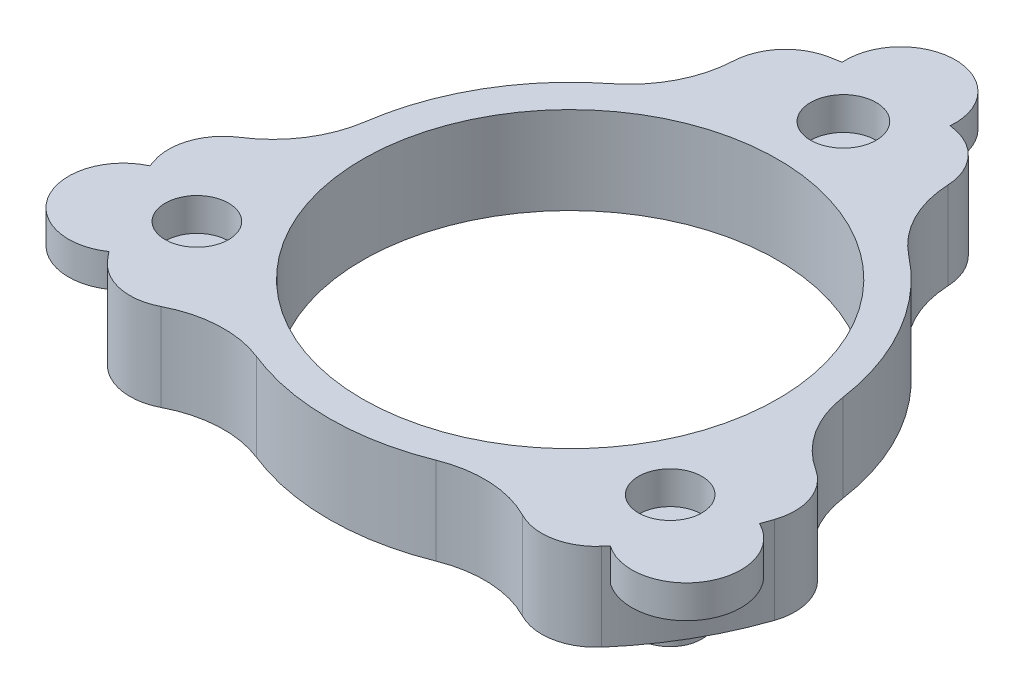
ISO-10303-21;
HEADER;
FILE_DESCRIPTION(('STEP AP214'),'2;1');
FILE_NAME('part.step','',(''),(''),'','','');
FILE_SCHEMA(('AUTOMOTIVE_DESIGN { 1 0 10303 214 1 1 1 1 }'));
ENDSEC;
DATA;
#1=APPLICATION_CONTEXT('core data for automotive mechanical design processes');
#2=APPLICATION_PROTOCOL_DEFINITION('international standard','automotive_design',2000,#1);
#3=PRODUCT_CONTEXT('',#1,'mechanical');
#4=PRODUCT('Part','Part','',(#3));
#5=PRODUCT_RELATED_PRODUCT_CATEGORY('part','',(#4));
#6=PRODUCT_DEFINITION_FORMATION('','',#4);
#7=PRODUCT_DEFINITION_CONTEXT('part definition',#1,'design');
#8=PRODUCT_DEFINITION('design','',#6,#7);
#9=PRODUCT_DEFINITION_SHAPE('','',#8);
#10=(LENGTH_UNIT() NAMED_UNIT(*) SI_UNIT(.MILLI.,.METRE.));
#11=(NAMED_UNIT(*) PLANE_ANGLE_UNIT() SI_UNIT($,.RADIAN.));
#12=(NAMED_UNIT(*) SI_UNIT($,.STERADIAN.) SOLID_ANGLE_UNIT());
#13=UNCERTAINTY_MEASURE_WITH_UNIT(LENGTH_MEASURE(1.E-05),#10,'distance_accuracy_value','');
#14=(GEOMETRIC_REPRESENTATION_CONTEXT(3) GLOBAL_UNCERTAINTY_ASSIGNED_CONTEXT((#13)) GLOBAL_UNIT_ASSIGNED_CONTEXT((#10,
#11,#12)) REPRESENTATION_CONTEXT('',''));
#15=CARTESIAN_POINT('',(0.,0.,0.));
#16=DIRECTION('',(0.,0.,1.));
#17=DIRECTION('',(1.,0.,0.));
#18=AXIS2_PLACEMENT_3D('',#15,#16,#17);
#19=CARTESIAN_POINT('',(0.,8.,0.));
#20=DIRECTION('',(0.,1.,0.));
#21=DIRECTION('',(0.,0.,1.));
#22=AXIS2_PLACEMENT_3D('',#19,#20,#21);
#23=PLANE('',#22);
#24=CARTESIAN_POINT('',(1.60090602130669E-12,8.,-24.9999999999991));
#25=DIRECTION('',(0.,1.,0.));
#26=DIRECTION('',(0.,0.,1.));
#27=AXIS2_PLACEMENT_3D('',#24,#25,#26);
#28=CIRCLE('',#27,3.);
#29=CARTESIAN_POINT('',(1.60090602130669E-12,8.,-21.9999999999991));
#30=VERTEX_POINT('',#29);
#31=EDGE_CURVE('E364',#30,#30,#28,.T.);
#32=ORIENTED_EDGE('',*,*,#31,.F.);
#33=EDGE_LOOP('',(#32));
#34=FACE_BOUND('',#33,.T.);
#35=CARTESIAN_POINT('',(21.650635094611,8.,12.5000000000018));
#36=DIRECTION('',(0.,1.,0.));
#37=DIRECTION('',(0.,0.,1.));
#38=AXIS2_PLACEMENT_3D('',#35,#36,#37);
#39=CIRCLE('',#38,2.9);
#40=CARTESIAN_POINT('',(21.650635094611,8.,15.4000000000018));
#41=VERTEX_POINT('',#40);
#42=EDGE_CURVE('E370',#41,#41,#39,.T.);
#43=ORIENTED_EDGE('',*,*,#42,.F.);
#44=EDGE_LOOP('',(#43));
#45=FACE_BOUND('',#44,.T.);
#46=CARTESIAN_POINT('',(-21.650635094611,8.,12.5));
#47=DIRECTION('',(0.,1.,0.));
#48=DIRECTION('',(0.,0.,1.));
#49=AXIS2_PLACEMENT_3D('',#46,#47,#48);
#50=CIRCLE('',#49,2.9);
#51=CARTESIAN_POINT('',(-21.650635094611,8.,15.4));
#52=VERTEX_POINT('',#51);
#53=EDGE_CURVE('E361',#52,#52,#50,.T.);
#54=ORIENTED_EDGE('',*,*,#53,.F.);
#55=EDGE_LOOP('',(#54));
#56=FACE_BOUND('',#55,.T.);
#57=CARTESIAN_POINT('',(0.,8.,0.));
#58=DIRECTION('',(0.,1.,0.));
#59=DIRECTION('',(0.,0.,1.));
#60=AXIS2_PLACEMENT_3D('',#57,#58,#59);
#61=CIRCLE('',#60,19.);
#62=CARTESIAN_POINT('',(0.,8.,19.));
#63=VERTEX_POINT('',#62);
#64=EDGE_CURVE('E401',#63,#63,#61,.T.);
#65=ORIENTED_EDGE('',*,*,#64,.F.);
#66=EDGE_LOOP('',(#65));
#67=FACE_BOUND('',#66,.T.);
#68=CARTESIAN_POINT('',(0.,8.,0.));
#69=DIRECTION('',(0.,1.,0.));
#70=DIRECTION('',(0.,0.,1.));
#71=AXIS2_PLACEMENT_3D('',#68,#69,#70);
#72=CIRCLE('',#71,30.);
#73=CARTESIAN_POINT('',(-4.73941231097717,8.,-29.6232673914705));
#74=VERTEX_POINT('',#73);
#75=CARTESIAN_POINT('',(-5.78788047023531,8.,-29.4363795270796));
#76=VERTEX_POINT('',#75);
#77=EDGE_CURVE('E405',#74,#76,#72,.T.);
#78=ORIENTED_EDGE('',*,*,#77,.T.);
#79=CARTESIAN_POINT('',(-4.82323372519609,8.,-24.5303162725663));
#80=DIRECTION('',(0.,1.,0.));
#81=DIRECTION('',(0.,0.,1.));
#82=AXIS2_PLACEMENT_3D('',#79,#80,#81);
#83=CIRCLE('',#82,5.);
#84=CARTESIAN_POINT('',(-9.81802138609295,8.,-24.7585622419778));
#85=VERTEX_POINT('',#84);
#86=EDGE_CURVE('E298',#76,#85,#83,.T.);
#87=ORIENTED_EDGE('',*,*,#86,.T.);
#88=CARTESIAN_POINT('',(-19.8075967078866,8.,-25.2150541808007));
#89=DIRECTION('',(0.,1.,0.));
#90=DIRECTION('',(0.,0.,1.));
#91=AXIS2_PLACEMENT_3D('',#88,#89,#90);
#92=CIRCLE('',#91,10.);
#93=CARTESIAN_POINT('',(-13.6301971895271,8.,-17.3512297174386));
#94=VERTEX_POINT('',#93);
#95=EDGE_CURVE('E279',#85,#94,#92,.F.);
#96=ORIENTED_EDGE('',*,*,#95,.T.);
#97=CARTESIAN_POINT('',(0.,8.,0.));
#98=DIRECTION('',(0.,1.,0.));
#99=DIRECTION('',(0.,0.,1.));
#100=AXIS2_PLACEMENT_3D('',#97,#98,#99);
#101=CIRCLE('',#100,22.0646198275139);
#102=CARTESIAN_POINT('',(-21.8417043169647,8.,-3.12848216600344));
#103=VERTEX_POINT('',#102);
#104=EDGE_CURVE('E356',#94,#103,#101,.T.);
#105=ORIENTED_EDGE('',*,*,#104,.T.);
#106=CARTESIAN_POINT('',(-31.7406758323175,8.,-4.54635484654804));
#107=DIRECTION('',(0.,1.,0.));
#108=DIRECTION('',(0.,0.,1.));
#109=AXIS2_PLACEMENT_3D('',#106,#107,#108);
#110=CIRCLE('',#109,10.);
#111=CARTESIAN_POINT('',(-26.3505545557776,8.,3.87662518573222));
#112=VERTEX_POINT('',#111);
#113=EDGE_CURVE('E256',#103,#112,#110,.F.);
#114=ORIENTED_EDGE('',*,*,#113,.T.);
#115=CARTESIAN_POINT('',(-23.6554939175076,8.,8.08811520187234));
#116=DIRECTION('',(0.,1.,0.));
#117=DIRECTION('',(0.,0.,1.));
#118=AXIS2_PLACEMENT_3D('',#115,#116,#117);
#119=CIRCLE('',#118,5.);
#120=CARTESIAN_POINT('',(-28.3865927010092,8.,9.70573824224681));
#121=VERTEX_POINT('',#120);
#122=EDGE_CURVE('E296',#112,#121,#119,.T.);
#123=ORIENTED_EDGE('',*,*,#122,.T.);
#124=CARTESIAN_POINT('',(-28.1963396042238,8.,10.2453127294037));
#125=VERTEX_POINT('',#124);
#126=EDGE_CURVE('E210',#121,#125,#72,.T.);
#127=ORIENTED_EDGE('',*,*,#126,.T.);
#128=CARTESIAN_POINT('',(-26.1031109845426,8.,14.7860608996667));
#129=DIRECTION('',(0.,1.,0.));
#130=DIRECTION('',(0.,0.,1.));
#131=AXIS2_PLACEMENT_3D('',#128,#129,#130);
#132=CIRCLE('',#131,5.);
#133=CARTESIAN_POINT('',(-23.284795948624,8.,18.9160851560502));
#134=VERTEX_POINT('',#133);
#135=EDGE_CURVE('E383',#125,#134,#132,.T.);
#136=ORIENTED_EDGE('',*,*,#135,.T.);
#137=CARTESIAN_POINT('',(-22.5987122307734,8.,19.7306412848314));
#138=VERTEX_POINT('',#137);
#139=EDGE_CURVE('E206',#134,#138,#72,.T.);
#140=ORIENTED_EDGE('',*,*,#139,.T.);
#141=CARTESIAN_POINT('',(-18.8322601923112,8.,16.4422010706928));
#142=DIRECTION('',(0.,1.,0.));
#143=DIRECTION('',(0.,0.,1.));
#144=AXIS2_PLACEMENT_3D('',#141,#142,#143);
#145=CIRCLE('',#144,5.);
#146=CARTESIAN_POINT('',(-16.5325331696845,8.,20.8819370562443));
#147=VERTEX_POINT('',#146);
#148=EDGE_CURVE('E294',#138,#147,#145,.T.);
#149=ORIENTED_EDGE('',*,*,#148,.T.);
#150=CARTESIAN_POINT('',(-11.9330791244311,8.,29.7614090273472));
#151=DIRECTION('',(0.,1.,0.));
#152=DIRECTION('',(0.,0.,1.));
#153=AXIS2_PLACEMENT_3D('',#150,#151,#152);
#154=CIRCLE('',#153,10.);
#155=CARTESIAN_POINT('',(-8.21150712743779,8.,20.479711883441));
#156=VERTEX_POINT('',#155);
#157=EDGE_CURVE('E261',#147,#156,#154,.F.);
#158=ORIENTED_EDGE('',*,*,#157,.T.);
#159=CARTESIAN_POINT('',(0.,8.,0.));
#160=DIRECTION('',(0.,1.,0.));
#161=DIRECTION('',(0.,0.,1.));
#162=AXIS2_PLACEMENT_3D('',#159,#160,#161);
#163=CIRCLE('',#162,22.0646198275139);
#164=CARTESIAN_POINT('',(8.21150712743663,8.,20.4797118834415));
#165=VERTEX_POINT('',#164);
#166=EDGE_CURVE('E349',#156,#165,#163,.T.);
#167=ORIENTED_EDGE('',*,*,#166,.T.);
#168=CARTESIAN_POINT('',(11.9330791244294,8.,29.7614090273479));
#169=DIRECTION('',(0.,1.,0.));
#170=DIRECTION('',(0.,0.,1.));
#171=AXIS2_PLACEMENT_3D('',#168,#169,#170);
#172=CIRCLE('',#171,10.);
#173=CARTESIAN_POINT('',(16.5325331696833,8.,20.8819370562452));
#174=VERTEX_POINT('',#173);
#175=EDGE_CURVE('E266',#165,#174,#172,.F.);
#176=ORIENTED_EDGE('',*,*,#175,.T.);
#177=CARTESIAN_POINT('',(18.8322601923102,8.,16.4422010706939));
#178=DIRECTION('',(0.,1.,0.));
#179=DIRECTION('',(0.,0.,1.));
#180=AXIS2_PLACEMENT_3D('',#177,#178,#179);
#181=CIRCLE('',#180,5.);
#182=CARTESIAN_POINT('',(22.5987122307723,8.,19.7306412848327));
#183=VERTEX_POINT('',#182);
#184=EDGE_CURVE('E202',#174,#183,#181,.T.);
#185=ORIENTED_EDGE('',*,*,#184,.T.);
#186=CARTESIAN_POINT('',(22.9708708954916,8.,19.2960900262892));
#187=VERTEX_POINT('',#186);
#188=EDGE_CURVE('E195',#183,#187,#72,.T.);
#189=ORIENTED_EDGE('',*,*,#188,.T.);
#190=CARTESIAN_POINT('',(25.8566598532865,8.,15.2129267805851));
#191=DIRECTION('',(0.,1.,0.));
#192=DIRECTION('',(0.,0.,1.));
#193=AXIS2_PLACEMENT_3D('',#190,#191,#192);
#194=CIRCLE('',#193,5.);
#195=CARTESIAN_POINT('',(28.0242082596012,8.,10.7071822354203));
#196=VERTEX_POINT('',#195);
#197=EDGE_CURVE('E199',#187,#196,#194,.T.);
#198=ORIENTED_EDGE('',*,*,#197,.T.);
#199=CARTESIAN_POINT('',(28.3865927010087,8.,9.70573824224818));
#200=VERTEX_POINT('',#199);
#201=EDGE_CURVE('E207',#196,#200,#72,.T.);
#202=ORIENTED_EDGE('',*,*,#201,.T.);
#203=CARTESIAN_POINT('',(23.6554939175073,8.,8.08811520187348));
#204=DIRECTION('',(0.,1.,0.));
#205=DIRECTION('',(0.,0.,1.));
#206=AXIS2_PLACEMENT_3D('',#203,#204,#205);
#207=CIRCLE('',#206,5.);
#208=CARTESIAN_POINT('',(26.3505545557774,8.,3.87662518573348));
#209=VERTEX_POINT('',#208);
#210=EDGE_CURVE('E291',#200,#209,#207,.T.);
#211=ORIENTED_EDGE('',*,*,#210,.T.);
#212=CARTESIAN_POINT('',(31.7406758323177,8.,-4.54635484654652));
#213=DIRECTION('',(0.,1.,0.));
#214=DIRECTION('',(0.,0.,1.));
#215=AXIS2_PLACEMENT_3D('',#212,#213,#214);
#216=CIRCLE('',#215,10.);
#217=CARTESIAN_POINT('',(21.8417043169649,8.,-3.1284821660024));
#218=VERTEX_POINT('',#217);
#219=EDGE_CURVE('E270',#209,#218,#216,.F.);
#220=ORIENTED_EDGE('',*,*,#219,.T.);
#221=CARTESIAN_POINT('',(0.,8.,0.));
#222=DIRECTION('',(0.,1.,0.));
#223=DIRECTION('',(0.,0.,1.));
#224=AXIS2_PLACEMENT_3D('',#221,#222,#223);
#225=CIRCLE('',#224,22.0646198275139);
#226=CARTESIAN_POINT('',(13.630197189528,8.,-17.3512297174379));
#227=VERTEX_POINT('',#226);
#228=EDGE_CURVE('E353',#218,#227,#225,.T.);
#229=ORIENTED_EDGE('',*,*,#228,.T.);
#230=CARTESIAN_POINT('',(19.807596707888,8.,-25.2150541807996));
#231=DIRECTION('',(0.,1.,0.));
#232=DIRECTION('',(0.,0.,1.));
#233=AXIS2_PLACEMENT_3D('',#230,#231,#232);
#234=CIRCLE('',#233,10.);
#235=CARTESIAN_POINT('',(9.81802138609424,8.,-24.7585622419772));
#236=VERTEX_POINT('',#235);
#237=EDGE_CURVE('E274',#227,#236,#234,.F.);
#238=ORIENTED_EDGE('',*,*,#237,.T.);
#239=CARTESIAN_POINT('',(4.82323372519738,8.,-24.530316272566));
#240=DIRECTION('',(0.,1.,0.));
#241=DIRECTION('',(0.,0.,1.));
#242=AXIS2_PLACEMENT_3D('',#239,#240,#241);
#243=CIRCLE('',#242,5.);
#244=CARTESIAN_POINT('',(5.78788047023686,8.,-29.4363795270793));
#245=VERTEX_POINT('',#244);
#246=EDGE_CURVE('E289',#236,#245,#243,.T.);
#247=ORIENTED_EDGE('',*,*,#246,.T.);
#248=CARTESIAN_POINT('',(5.22546870873223,8.,-29.5414027556929));
#249=VERTEX_POINT('',#248);
#250=EDGE_CURVE('E209',#245,#249,#72,.T.);
#251=ORIENTED_EDGE('',*,*,#250,.T.);
#252=CARTESIAN_POINT('',(0.246451131256085,8.,-29.9989876802519));
#253=DIRECTION('',(0.,1.,0.));
#254=DIRECTION('',(0.,0.,1.));
#255=AXIS2_PLACEMENT_3D('',#252,#253,#254);
#256=CIRCLE('',#255,5.);
#257=EDGE_CURVE('E378',#249,#74,#256,.T.);
#258=ORIENTED_EDGE('',*,*,#257,.T.);
#259=EDGE_LOOP('',(#78,#87,#96,#105,#114,#123,#127,#136,#140,#149,#158,#167,#176,#185,#189,#198,
#202,#211,#220,#229,#238,#247,#251,#258));
#260=FACE_BOUND('',#259,.T.);
#261=ADVANCED_FACE('F33',(#34,#45,#56,#67,#260),#23,.T.);
#262=CARTESIAN_POINT('',(0.,8.,0.));
#263=DIRECTION('',(0.,-1.,0.));
#264=DIRECTION('',(0.,0.,-1.));
#265=AXIS2_PLACEMENT_3D('',#262,#263,#264);
#266=CYLINDRICAL_SURFACE('',#265,30.);
#267=ORIENTED_EDGE('',*,*,#188,.F.);
#268=DIRECTION('',(0.,-1.,0.));
#269=VECTOR('',#268,1.);
#270=CARTESIAN_POINT('',(22.5987122307723,8.,19.7306412848327));
#271=LINE('',#270,#269);
#272=CARTESIAN_POINT('',(22.5987122307723,0.,19.7306412848327));
#273=VERTEX_POINT('',#272);
#274=EDGE_CURVE('E329',#183,#273,#271,.T.);
#275=ORIENTED_EDGE('',*,*,#274,.T.);
#276=CARTESIAN_POINT('',(0.,0.,0.));
#277=DIRECTION('',(0.,1.,0.));
#278=DIRECTION('',(0.,0.,1.));
#279=AXIS2_PLACEMENT_3D('',#276,#277,#278);
#280=CIRCLE('',#279,30.);
#281=CARTESIAN_POINT('',(28.3865927010087,0.,9.70573824224818));
#282=VERTEX_POINT('',#281);
#283=EDGE_CURVE('E332',#273,#282,#280,.T.);
#284=ORIENTED_EDGE('',*,*,#283,.T.);
#285=DIRECTION('',(0.,-1.,0.));
#286=VECTOR('',#285,1.);
#287=CARTESIAN_POINT('',(28.3865927010087,8.,9.70573824224818));
#288=LINE('',#287,#286);
#289=EDGE_CURVE('E326',#282,#200,#288,.F.);
#290=ORIENTED_EDGE('',*,*,#289,.T.);
#291=ORIENTED_EDGE('',*,*,#201,.F.);
#292=DIRECTION('',(0.,1.,0.));
#293=VECTOR('',#292,1.);
#294=CARTESIAN_POINT('',(28.0242082596012,6.5,10.7071822354203));
#295=LINE('',#294,#293);
#296=CARTESIAN_POINT('',(28.0242082596012,5.,10.7071822354203));
#297=VERTEX_POINT('',#296);
#298=EDGE_CURVE('E217',#196,#297,#295,.F.);
#299=ORIENTED_EDGE('',*,*,#298,.T.);
#300=CARTESIAN_POINT('',(0.,5.,0.));
#301=DIRECTION('',(0.,1.,0.));
#302=DIRECTION('',(0.,0.,1.));
#303=AXIS2_PLACEMENT_3D('',#300,#301,#302);
#304=CIRCLE('',#303,30.);
#305=CARTESIAN_POINT('',(22.9708708954916,5.,19.2960900262892));
#306=VERTEX_POINT('',#305);
#307=EDGE_CURVE('E224',#306,#297,#304,.T.);
#308=ORIENTED_EDGE('',*,*,#307,.F.);
#309=DIRECTION('',(0.,1.,0.));
#310=VECTOR('',#309,1.);
#311=CARTESIAN_POINT('',(22.9708708954916,6.5,19.2960900262892));
#312=LINE('',#311,#310);
#313=EDGE_CURVE('E214',#306,#187,#312,.T.);
#314=ORIENTED_EDGE('',*,*,#313,.T.);
#315=EDGE_LOOP('',(#267,#275,#284,#290,#291,#299,#308,#314));
#316=FACE_BOUND('',#315,.T.);
#317=ADVANCED_FACE('F223',(#316),#266,.T.);
#318=CARTESIAN_POINT('',(5.78788047023686,0.,-29.4363795270793));
#319=VERTEX_POINT('',#318);
#320=CARTESIAN_POINT('',(-5.78788047023531,0.,-29.4363795270796));
#321=VERTEX_POINT('',#320);
#322=EDGE_CURVE('E339',#319,#321,#280,.T.);
#323=ORIENTED_EDGE('',*,*,#322,.T.);
#324=DIRECTION('',(0.,-1.,0.));
#325=VECTOR('',#324,1.);
#326=CARTESIAN_POINT('',(-5.78788047023531,8.,-29.4363795270796));
#327=LINE('',#326,#325);
#328=EDGE_CURVE('E286',#321,#76,#327,.F.);
#329=ORIENTED_EDGE('',*,*,#328,.T.);
#330=ORIENTED_EDGE('',*,*,#77,.F.);
#331=DIRECTION('',(0.,1.,0.));
#332=VECTOR('',#331,1.);
#333=CARTESIAN_POINT('',(-4.73941231097717,6.5,-29.6232673914705));
#334=LINE('',#333,#332);
#335=CARTESIAN_POINT('',(-4.73941231097717,5.,-29.6232673914705));
#336=VERTEX_POINT('',#335);
#337=EDGE_CURVE('E423',#74,#336,#334,.F.);
#338=ORIENTED_EDGE('',*,*,#337,.T.);
#339=CARTESIAN_POINT('',(0.,5.,0.));
#340=DIRECTION('',(0.,1.,0.));
#341=DIRECTION('',(0.,0.,1.));
#342=AXIS2_PLACEMENT_3D('',#339,#340,#341);
#343=CIRCLE('',#342,30.);
#344=CARTESIAN_POINT('',(5.22546870873223,5.,-29.5414027556929));
#345=VERTEX_POINT('',#344);
#346=EDGE_CURVE('E421',#345,#336,#343,.T.);
#347=ORIENTED_EDGE('',*,*,#346,.F.);
#348=DIRECTION('',(0.,1.,0.));
#349=VECTOR('',#348,1.);
#350=CARTESIAN_POINT('',(5.22546870873223,6.5,-29.5414027556929));
#351=LINE('',#350,#349);
#352=EDGE_CURVE('E426',#345,#249,#351,.T.);
#353=ORIENTED_EDGE('',*,*,#352,.T.);
#354=ORIENTED_EDGE('',*,*,#250,.F.);
#355=DIRECTION('',(0.,-1.,0.));
#356=VECTOR('',#355,1.);
#357=CARTESIAN_POINT('',(5.78788047023686,8.,-29.4363795270793));
#358=LINE('',#357,#356);
#359=EDGE_CURVE('E284',#245,#319,#358,.T.);
#360=ORIENTED_EDGE('',*,*,#359,.T.);
#361=EDGE_LOOP('',(#323,#329,#330,#338,#347,#353,#354,#360));
#362=FACE_BOUND('',#361,.T.);
#363=ADVANCED_FACE('F462',(#362),#266,.T.);
#364=CARTESIAN_POINT('',(0.,0.,0.));
#365=DIRECTION('',(0.,1.,0.));
#366=DIRECTION('',(0.,0.,1.));
#367=AXIS2_PLACEMENT_3D('',#364,#365,#366);
#368=PLANE('',#367);
#369=CARTESIAN_POINT('',(0.,0.,0.));
#370=DIRECTION('',(0.,1.,0.));
#371=DIRECTION('',(0.,0.,1.));
#372=AXIS2_PLACEMENT_3D('',#369,#370,#371);
#373=CIRCLE('',#372,19.);
#374=CARTESIAN_POINT('',(0.,0.,19.));
#375=VERTEX_POINT('',#374);
#376=EDGE_CURVE('E220',#375,#375,#373,.T.);
#377=ORIENTED_EDGE('',*,*,#376,.T.);
#378=EDGE_LOOP('',(#377));
#379=FACE_BOUND('',#378,.T.);
#380=CARTESIAN_POINT('',(1.60090602130669E-12,0.,-24.9999999999991));
#381=DIRECTION('',(0.,1.,0.));
#382=DIRECTION('',(0.,0.,1.));
#383=AXIS2_PLACEMENT_3D('',#380,#381,#382);
#384=CIRCLE('',#383,2.9);
#385=CARTESIAN_POINT('',(1.60090602130669E-12,0.,-22.0999999999991));
#386=VERTEX_POINT('',#385);
#387=EDGE_CURVE('E392',#386,#386,#384,.T.);
#388=ORIENTED_EDGE('',*,*,#387,.T.);
#389=EDGE_LOOP('',(#388));
#390=FACE_BOUND('',#389,.T.);
#391=CARTESIAN_POINT('',(21.650635094611,0.,12.5000000000018));
#392=DIRECTION('',(0.,1.,0.));
#393=DIRECTION('',(0.,0.,1.));
#394=AXIS2_PLACEMENT_3D('',#391,#392,#393);
#395=CIRCLE('',#394,2.9);
#396=CARTESIAN_POINT('',(21.650635094611,0.,15.4000000000018));
#397=VERTEX_POINT('',#396);
#398=EDGE_CURVE('E396',#397,#397,#395,.T.);
#399=ORIENTED_EDGE('',*,*,#398,.T.);
#400=EDGE_LOOP('',(#399));
#401=FACE_BOUND('',#400,.T.);
#402=CARTESIAN_POINT('',(-21.650635094611,0.,12.5));
#403=DIRECTION('',(0.,1.,0.));
#404=DIRECTION('',(0.,0.,1.));
#405=AXIS2_PLACEMENT_3D('',#402,#403,#404);
#406=CIRCLE('',#405,2.9);
#407=CARTESIAN_POINT('',(-21.650635094611,0.,15.4));
#408=VERTEX_POINT('',#407);
#409=EDGE_CURVE('E400',#408,#408,#406,.T.);
#410=ORIENTED_EDGE('',*,*,#409,.T.);
#411=EDGE_LOOP('',(#410));
#412=FACE_BOUND('',#411,.T.);
#413=CARTESIAN_POINT('',(-19.8075967078866,0.,-25.2150541808007));
#414=DIRECTION('',(0.,1.,0.));
#415=DIRECTION('',(0.,0.,1.));
#416=AXIS2_PLACEMENT_3D('',#413,#414,#415);
#417=CIRCLE('',#416,10.);
#418=CARTESIAN_POINT('',(-13.6301971895271,0.,-17.3512297174386));
#419=VERTEX_POINT('',#418);
#420=CARTESIAN_POINT('',(-9.81802138609295,0.,-24.7585622419778));
#421=VERTEX_POINT('',#420);
#422=EDGE_CURVE('E281',#419,#421,#417,.T.);
#423=ORIENTED_EDGE('',*,*,#422,.T.);
#424=CARTESIAN_POINT('',(-4.82323372519609,0.,-24.5303162725663));
#425=DIRECTION('',(0.,1.,0.));
#426=DIRECTION('',(0.,0.,1.));
#427=AXIS2_PLACEMENT_3D('',#424,#425,#426);
#428=CIRCLE('',#427,5.);
#429=EDGE_CURVE('E311',#421,#321,#428,.F.);
#430=ORIENTED_EDGE('',*,*,#429,.T.);
#431=ORIENTED_EDGE('',*,*,#322,.F.);
#432=CARTESIAN_POINT('',(4.82323372519738,0.,-24.530316272566));
#433=DIRECTION('',(0.,1.,0.));
#434=DIRECTION('',(0.,0.,1.));
#435=AXIS2_PLACEMENT_3D('',#432,#433,#434);
#436=CIRCLE('',#435,5.);
#437=CARTESIAN_POINT('',(9.81802138609424,0.,-24.7585622419772));
#438=VERTEX_POINT('',#437);
#439=EDGE_CURVE('E55',#319,#438,#436,.F.);
#440=ORIENTED_EDGE('',*,*,#439,.T.);
#441=CARTESIAN_POINT('',(19.807596707888,0.,-25.2150541807996));
#442=DIRECTION('',(0.,1.,0.));
#443=DIRECTION('',(0.,0.,1.));
#444=AXIS2_PLACEMENT_3D('',#441,#442,#443);
#445=CIRCLE('',#444,10.);
#446=CARTESIAN_POINT('',(13.630197189528,0.,-17.3512297174379));
#447=VERTEX_POINT('',#446);
#448=EDGE_CURVE('E277',#438,#447,#445,.T.);
#449=ORIENTED_EDGE('',*,*,#448,.T.);
#450=CARTESIAN_POINT('',(0.,0.,0.));
#451=DIRECTION('',(0.,1.,0.));
#452=DIRECTION('',(0.,0.,1.));
#453=AXIS2_PLACEMENT_3D('',#450,#451,#452);
#454=CIRCLE('',#453,22.0646198275139);
#455=CARTESIAN_POINT('',(21.8417043169649,0.,-3.1284821660024));
#456=VERTEX_POINT('',#455);
#457=EDGE_CURVE('E228',#456,#447,#454,.T.);
#458=ORIENTED_EDGE('',*,*,#457,.F.);
#459=CARTESIAN_POINT('',(31.7406758323177,0.,-4.54635484654652));
#460=DIRECTION('',(0.,1.,0.));
#461=DIRECTION('',(0.,0.,1.));
#462=AXIS2_PLACEMENT_3D('',#459,#460,#461);
#463=CIRCLE('',#462,10.);
#464=CARTESIAN_POINT('',(26.3505545557774,0.,3.87662518573348));
#465=VERTEX_POINT('',#464);
#466=EDGE_CURVE('E272',#456,#465,#463,.T.);
#467=ORIENTED_EDGE('',*,*,#466,.T.);
#468=CARTESIAN_POINT('',(23.6554939175073,0.,8.08811520187348));
#469=DIRECTION('',(0.,1.,0.));
#470=DIRECTION('',(0.,0.,1.));
#471=AXIS2_PLACEMENT_3D('',#468,#469,#470);
#472=CIRCLE('',#471,5.);
#473=EDGE_CURVE('E303',#465,#282,#472,.F.);
#474=ORIENTED_EDGE('',*,*,#473,.T.);
#475=ORIENTED_EDGE('',*,*,#283,.F.);
#476=CARTESIAN_POINT('',(18.8322601923102,0.,16.4422010706939));
#477=DIRECTION('',(0.,1.,0.));
#478=DIRECTION('',(0.,0.,1.));
#479=AXIS2_PLACEMENT_3D('',#476,#477,#478);
#480=CIRCLE('',#479,5.);
#481=CARTESIAN_POINT('',(16.5325331696833,0.,20.8819370562452));
#482=VERTEX_POINT('',#481);
#483=EDGE_CURVE('E305',#273,#482,#480,.F.);
#484=ORIENTED_EDGE('',*,*,#483,.T.);
#485=CARTESIAN_POINT('',(11.9330791244294,0.,29.7614090273479));
#486=DIRECTION('',(0.,1.,0.));
#487=DIRECTION('',(0.,0.,1.));
#488=AXIS2_PLACEMENT_3D('',#485,#486,#487);
#489=CIRCLE('',#488,10.);
#490=CARTESIAN_POINT('',(8.21150712743663,0.,20.4797118834415));
#491=VERTEX_POINT('',#490);
#492=EDGE_CURVE('E268',#482,#491,#489,.T.);
#493=ORIENTED_EDGE('',*,*,#492,.T.);
#494=CARTESIAN_POINT('',(0.,0.,0.));
#495=DIRECTION('',(0.,1.,0.));
#496=DIRECTION('',(0.,0.,1.));
#497=AXIS2_PLACEMENT_3D('',#494,#495,#496);
#498=CIRCLE('',#497,22.0646198275139);
#499=CARTESIAN_POINT('',(-8.21150712743779,0.,20.479711883441));
#500=VERTEX_POINT('',#499);
#501=EDGE_CURVE('E238',#500,#491,#498,.T.);
#502=ORIENTED_EDGE('',*,*,#501,.F.);
#503=CARTESIAN_POINT('',(-11.9330791244311,0.,29.7614090273472));
#504=DIRECTION('',(0.,1.,0.));
#505=DIRECTION('',(0.,0.,1.));
#506=AXIS2_PLACEMENT_3D('',#503,#504,#505);
#507=CIRCLE('',#506,10.);
#508=CARTESIAN_POINT('',(-16.5325331696845,0.,20.8819370562443));
#509=VERTEX_POINT('',#508);
#510=EDGE_CURVE('E263',#500,#509,#507,.T.);
#511=ORIENTED_EDGE('',*,*,#510,.T.);
#512=CARTESIAN_POINT('',(-18.8322601923112,0.,16.4422010706928));
#513=DIRECTION('',(0.,1.,0.));
#514=DIRECTION('',(0.,0.,1.));
#515=AXIS2_PLACEMENT_3D('',#512,#513,#514);
#516=CIRCLE('',#515,5.);
#517=CARTESIAN_POINT('',(-22.5987122307734,0.,19.7306412848314));
#518=VERTEX_POINT('',#517);
#519=EDGE_CURVE('E307',#509,#518,#516,.F.);
#520=ORIENTED_EDGE('',*,*,#519,.T.);
#521=CARTESIAN_POINT('',(-28.3865927010092,0.,9.70573824224681));
#522=VERTEX_POINT('',#521);
#523=EDGE_CURVE('E341',#522,#518,#280,.T.);
#524=ORIENTED_EDGE('',*,*,#523,.F.);
#525=CARTESIAN_POINT('',(-23.6554939175076,0.,8.08811520187234));
#526=DIRECTION('',(0.,1.,0.));
#527=DIRECTION('',(0.,0.,1.));
#528=AXIS2_PLACEMENT_3D('',#525,#526,#527);
#529=CIRCLE('',#528,5.);
#530=CARTESIAN_POINT('',(-26.3505545557776,0.,3.87662518573222));
#531=VERTEX_POINT('',#530);
#532=EDGE_CURVE('E309',#522,#531,#529,.F.);
#533=ORIENTED_EDGE('',*,*,#532,.T.);
#534=CARTESIAN_POINT('',(-31.7406758323175,0.,-4.54635484654804));
#535=DIRECTION('',(0.,1.,0.));
#536=DIRECTION('',(0.,0.,1.));
#537=AXIS2_PLACEMENT_3D('',#534,#535,#536);
#538=CIRCLE('',#537,10.);
#539=CARTESIAN_POINT('',(-21.8417043169647,0.,-3.12848216600344));
#540=VERTEX_POINT('',#539);
#541=EDGE_CURVE('E259',#531,#540,#538,.T.);
#542=ORIENTED_EDGE('',*,*,#541,.T.);
#543=CARTESIAN_POINT('',(0.,0.,0.));
#544=DIRECTION('',(0.,1.,0.));
#545=DIRECTION('',(0.,0.,1.));
#546=AXIS2_PLACEMENT_3D('',#543,#544,#545);
#547=CIRCLE('',#546,22.0646198275139);
#548=EDGE_CURVE('E225',#419,#540,#547,.T.);
#549=ORIENTED_EDGE('',*,*,#548,.F.);
#550=EDGE_LOOP('',(#423,#430,#431,#440,#449,#458,#467,#474,#475,#484,#493,#502,#511,#520,#524,
#533,#542,#549));
#551=FACE_BOUND('',#550,.T.);
#552=ADVANCED_FACE('F336',(#379,#390,#401,#412,#551),#368,.F.);
#553=ORIENTED_EDGE('',*,*,#126,.F.);
#554=DIRECTION('',(0.,-1.,0.));
#555=VECTOR('',#554,1.);
#556=CARTESIAN_POINT('',(-28.3865927010092,8.,9.70573824224681));
#557=LINE('',#556,#555);
#558=EDGE_CURVE('E319',#121,#522,#557,.T.);
#559=ORIENTED_EDGE('',*,*,#558,.T.);
#560=ORIENTED_EDGE('',*,*,#523,.T.);
#561=DIRECTION('',(0.,-1.,0.));
#562=VECTOR('',#561,1.);
#563=CARTESIAN_POINT('',(-22.5987122307734,8.,19.7306412848314));
#564=LINE('',#563,#562);
#565=EDGE_CURVE('E316',#518,#138,#564,.F.);
#566=ORIENTED_EDGE('',*,*,#565,.T.);
#567=ORIENTED_EDGE('',*,*,#139,.F.);
#568=DIRECTION('',(0.,1.,0.));
#569=VECTOR('',#568,1.);
#570=CARTESIAN_POINT('',(-23.284795948624,6.5,18.9160851560502));
#571=LINE('',#570,#569);
#572=CARTESIAN_POINT('',(-23.284795948624,5.,18.9160851560502));
#573=VERTEX_POINT('',#572);
#574=EDGE_CURVE('E415',#134,#573,#571,.F.);
#575=ORIENTED_EDGE('',*,*,#574,.T.);
#576=CARTESIAN_POINT('',(0.,5.,0.));
#577=DIRECTION('',(0.,1.,0.));
#578=DIRECTION('',(0.,0.,1.));
#579=AXIS2_PLACEMENT_3D('',#576,#577,#578);
#580=CIRCLE('',#579,30.);
#581=CARTESIAN_POINT('',(-28.1963396042238,5.,10.2453127294037));
#582=VERTEX_POINT('',#581);
#583=EDGE_CURVE('E404',#582,#573,#580,.T.);
#584=ORIENTED_EDGE('',*,*,#583,.F.);
#585=DIRECTION('',(0.,1.,0.));
#586=VECTOR('',#585,1.);
#587=CARTESIAN_POINT('',(-28.1963396042238,6.5,10.2453127294037));
#588=LINE('',#587,#586);
#589=EDGE_CURVE('E418',#582,#125,#588,.T.);
#590=ORIENTED_EDGE('',*,*,#589,.T.);
#591=EDGE_LOOP('',(#553,#559,#560,#566,#567,#575,#584,#590));
#592=FACE_BOUND('',#591,.T.);
#593=ADVANCED_FACE('F441',(#592),#266,.T.);
#594=CARTESIAN_POINT('',(0.,8.,0.));
#595=DIRECTION('',(0.,-1.,0.));
#596=DIRECTION('',(0.,0.,-1.));
#597=AXIS2_PLACEMENT_3D('',#594,#595,#596);
#598=CYLINDRICAL_SURFACE('',#597,19.);
#599=ORIENTED_EDGE('',*,*,#64,.T.);
#600=EDGE_LOOP('',(#599));
#601=FACE_BOUND('',#600,.T.);
#602=ORIENTED_EDGE('',*,*,#376,.F.);
#603=EDGE_LOOP('',(#602));
#604=FACE_BOUND('',#603,.T.);
#605=ADVANCED_FACE('F467',(#601,#604),#598,.F.);
#606=CARTESIAN_POINT('',(-21.650635094611,-2.,12.5));
#607=DIRECTION('',(0.,-1.,0.));
#608=DIRECTION('',(0.,0.,-1.));
#609=AXIS2_PLACEMENT_3D('',#606,#607,#608);
#610=PLANE('',#609);
#611=CARTESIAN_POINT('',(-21.650635094611,-2.,12.5));
#612=DIRECTION('',(0.,-1.,0.));
#613=DIRECTION('',(0.,0.,-1.));
#614=AXIS2_PLACEMENT_3D('',#611,#612,#613);
#615=CIRCLE('',#614,2.9);
#616=CARTESIAN_POINT('',(-21.650635094611,-2.,9.60000000000001));
#617=VERTEX_POINT('',#616);
#618=EDGE_CURVE('E397',#617,#617,#615,.T.);
#619=ORIENTED_EDGE('',*,*,#618,.T.);
#620=EDGE_LOOP('',(#619));
#621=FACE_BOUND('',#620,.T.);
#622=ADVANCED_FACE('F701',(#621),#610,.T.);
#623=CARTESIAN_POINT('',(-21.650635094611,8.,12.5));
#624=DIRECTION('',(0.,-1.,0.));
#625=DIRECTION('',(0.,0.,-1.));
#626=AXIS2_PLACEMENT_3D('',#623,#624,#625);
#627=CYLINDRICAL_SURFACE('',#626,2.9);
#628=ORIENTED_EDGE('',*,*,#618,.F.);
#629=EDGE_LOOP('',(#628));
#630=FACE_BOUND('',#629,.T.);
#631=ORIENTED_EDGE('',*,*,#409,.F.);
#632=EDGE_LOOP('',(#631));
#633=FACE_BOUND('',#632,.T.);
#634=ADVANCED_FACE('F710',(#630,#633),#627,.T.);
#635=CARTESIAN_POINT('',(21.650635094611,-2.,12.5000000000018));
#636=DIRECTION('',(0.,-1.,0.));
#637=DIRECTION('',(0.,0.,-1.));
#638=AXIS2_PLACEMENT_3D('',#635,#636,#637);
#639=PLANE('',#638);
#640=CARTESIAN_POINT('',(21.650635094611,-2.,12.5000000000018));
#641=DIRECTION('',(0.,-1.,0.));
#642=DIRECTION('',(0.,0.,-1.));
#643=AXIS2_PLACEMENT_3D('',#640,#641,#642);
#644=CIRCLE('',#643,2.9);
#645=CARTESIAN_POINT('',(21.650635094611,-2.,9.60000000000185));
#646=VERTEX_POINT('',#645);
#647=EDGE_CURVE('E393',#646,#646,#644,.T.);
#648=ORIENTED_EDGE('',*,*,#647,.T.);
#649=EDGE_LOOP('',(#648));
#650=FACE_BOUND('',#649,.T.);
#651=ADVANCED_FACE('F718',(#650),#639,.T.);
#652=CARTESIAN_POINT('',(21.650635094611,8.,12.5000000000018));
#653=DIRECTION('',(0.,-1.,0.));
#654=DIRECTION('',(0.,0.,-1.));
#655=AXIS2_PLACEMENT_3D('',#652,#653,#654);
#656=CYLINDRICAL_SURFACE('',#655,2.9);
#657=ORIENTED_EDGE('',*,*,#647,.F.);
#658=EDGE_LOOP('',(#657));
#659=FACE_BOUND('',#658,.T.);
#660=ORIENTED_EDGE('',*,*,#398,.F.);
#661=EDGE_LOOP('',(#660));
#662=FACE_BOUND('',#661,.T.);
#663=ADVANCED_FACE('F725',(#659,#662),#656,.T.);
#664=CARTESIAN_POINT('',(1.60090602130669E-12,-2.,-24.9999999999991));
#665=DIRECTION('',(0.,-1.,0.));
#666=DIRECTION('',(0.,0.,-1.));
#667=AXIS2_PLACEMENT_3D('',#664,#665,#666);
#668=PLANE('',#667);
#669=CARTESIAN_POINT('',(1.60090602130669E-12,-2.,-24.9999999999991));
#670=DIRECTION('',(0.,-1.,0.));
#671=DIRECTION('',(0.,0.,-1.));
#672=AXIS2_PLACEMENT_3D('',#669,#670,#671);
#673=CIRCLE('',#672,2.9);
#674=CARTESIAN_POINT('',(1.60090602130669E-12,-2.,-27.8999999999991));
#675=VERTEX_POINT('',#674);
#676=EDGE_CURVE('E388',#675,#675,#673,.T.);
#677=ORIENTED_EDGE('',*,*,#676,.T.);
#678=EDGE_LOOP('',(#677));
#679=FACE_BOUND('',#678,.T.);
#680=ADVANCED_FACE('F733',(#679),#668,.T.);
#681=CARTESIAN_POINT('',(1.60090602130669E-12,8.,-24.9999999999991));
#682=DIRECTION('',(0.,-1.,0.));
#683=DIRECTION('',(0.,0.,-1.));
#684=AXIS2_PLACEMENT_3D('',#681,#682,#683);
#685=CYLINDRICAL_SURFACE('',#684,2.9);
#686=ORIENTED_EDGE('',*,*,#676,.F.);
#687=EDGE_LOOP('',(#686));
#688=FACE_BOUND('',#687,.T.);
#689=ORIENTED_EDGE('',*,*,#387,.F.);
#690=EDGE_LOOP('',(#689));
#691=FACE_BOUND('',#690,.T.);
#692=ADVANCED_FACE('F454',(#688,#691),#685,.T.);
#693=CARTESIAN_POINT('',(-26.1031109845426,5.,14.7860608996667));
#694=DIRECTION('',(0.,1.,0.));
#695=DIRECTION('',(0.,0.,1.));
#696=AXIS2_PLACEMENT_3D('',#693,#694,#695);
#697=CYLINDRICAL_SURFACE('',#696,5.);
#698=ORIENTED_EDGE('',*,*,#589,.F.);
#699=CARTESIAN_POINT('',(-26.1031109845426,5.,14.7860608996667));
#700=DIRECTION('',(0.,1.,0.));
#701=DIRECTION('',(0.,0.,1.));
#702=AXIS2_PLACEMENT_3D('',#699,#700,#701);
#703=CIRCLE('',#702,5.);
#704=EDGE_CURVE('E385',#582,#573,#703,.T.);
#705=ORIENTED_EDGE('',*,*,#704,.T.);
#706=ORIENTED_EDGE('',*,*,#574,.F.);
#707=ORIENTED_EDGE('',*,*,#135,.F.);
#708=EDGE_LOOP('',(#698,#705,#706,#707));
#709=FACE_BOUND('',#708,.T.);
#710=ADVANCED_FACE('F437',(#709),#697,.T.);
#711=CARTESIAN_POINT('',(-26.1031109845426,5.,14.7860608996667));
#712=DIRECTION('',(0.,1.,0.));
#713=DIRECTION('',(0.,0.,1.));
#714=AXIS2_PLACEMENT_3D('',#711,#712,#713);
#715=PLANE('',#714);
#716=ORIENTED_EDGE('',*,*,#704,.F.);
#717=ORIENTED_EDGE('',*,*,#583,.T.);
#718=EDGE_LOOP('',(#716,#717));
#719=FACE_BOUND('',#718,.T.);
#720=ADVANCED_FACE('F443',(#719),#715,.F.);
#721=CARTESIAN_POINT('',(0.246451131256085,5.,-29.9989876802519));
#722=DIRECTION('',(0.,1.,0.));
#723=DIRECTION('',(0.,0.,1.));
#724=AXIS2_PLACEMENT_3D('',#721,#722,#723);
#725=CYLINDRICAL_SURFACE('',#724,5.);
#726=ORIENTED_EDGE('',*,*,#352,.F.);
#727=CARTESIAN_POINT('',(0.246451131256085,5.,-29.9989876802519));
#728=DIRECTION('',(0.,1.,0.));
#729=DIRECTION('',(0.,0.,1.));
#730=AXIS2_PLACEMENT_3D('',#727,#728,#729);
#731=CIRCLE('',#730,5.);
#732=EDGE_CURVE('E380',#345,#336,#731,.T.);
#733=ORIENTED_EDGE('',*,*,#732,.T.);
#734=ORIENTED_EDGE('',*,*,#337,.F.);
#735=ORIENTED_EDGE('',*,*,#257,.F.);
#736=EDGE_LOOP('',(#726,#733,#734,#735));
#737=FACE_BOUND('',#736,.T.);
#738=ADVANCED_FACE('F445',(#737),#725,.T.);
#739=CARTESIAN_POINT('',(0.246451131256085,5.,-29.9989876802519));
#740=DIRECTION('',(0.,1.,0.));
#741=DIRECTION('',(0.,0.,1.));
#742=AXIS2_PLACEMENT_3D('',#739,#740,#741);
#743=PLANE('',#742);
#744=ORIENTED_EDGE('',*,*,#732,.F.);
#745=ORIENTED_EDGE('',*,*,#346,.T.);
#746=EDGE_LOOP('',(#744,#745));
#747=FACE_BOUND('',#746,.T.);
#748=ADVANCED_FACE('F451',(#747),#743,.F.);
#749=CARTESIAN_POINT('',(25.8566598532865,5.,15.2129267805851));
#750=DIRECTION('',(0.,1.,0.));
#751=DIRECTION('',(0.,0.,1.));
#752=AXIS2_PLACEMENT_3D('',#749,#750,#751);
#753=CYLINDRICAL_SURFACE('',#752,5.);
#754=ORIENTED_EDGE('',*,*,#313,.F.);
#755=CARTESIAN_POINT('',(25.8566598532865,5.,15.2129267805851));
#756=DIRECTION('',(0.,1.,0.));
#757=DIRECTION('',(0.,0.,1.));
#758=AXIS2_PLACEMENT_3D('',#755,#756,#757);
#759=CIRCLE('',#758,5.);
#760=EDGE_CURVE('E219',#306,#297,#759,.T.);
#761=ORIENTED_EDGE('',*,*,#760,.T.);
#762=ORIENTED_EDGE('',*,*,#298,.F.);
#763=ORIENTED_EDGE('',*,*,#197,.F.);
#764=EDGE_LOOP('',(#754,#761,#762,#763));
#765=FACE_BOUND('',#764,.T.);
#766=ADVANCED_FACE('F212',(#765),#753,.T.);
#767=CARTESIAN_POINT('',(25.8566598532865,5.,15.2129267805851));
#768=DIRECTION('',(0.,1.,0.));
#769=DIRECTION('',(0.,0.,1.));
#770=AXIS2_PLACEMENT_3D('',#767,#768,#769);
#771=PLANE('',#770);
#772=ORIENTED_EDGE('',*,*,#760,.F.);
#773=ORIENTED_EDGE('',*,*,#307,.T.);
#774=EDGE_LOOP('',(#772,#773));
#775=FACE_BOUND('',#774,.T.);
#776=ADVANCED_FACE('F429',(#775),#771,.F.);
#777=CARTESIAN_POINT('',(-21.650635094611,5.,12.5));
#778=DIRECTION('',(0.,1.,0.));
#779=DIRECTION('',(0.,0.,1.));
#780=AXIS2_PLACEMENT_3D('',#777,#778,#779);
#781=CYLINDRICAL_SURFACE('',#780,2.9);
#782=CARTESIAN_POINT('',(-21.650635094611,5.,12.5));
#783=DIRECTION('',(0.,1.,0.));
#784=DIRECTION('',(0.,0.,1.));
#785=AXIS2_PLACEMENT_3D('',#782,#783,#784);
#786=CIRCLE('',#785,2.9);
#787=CARTESIAN_POINT('',(-21.650635094611,5.,15.4));
#788=VERTEX_POINT('',#787);
#789=EDGE_CURVE('E373',#788,#788,#786,.T.);
#790=ORIENTED_EDGE('',*,*,#789,.F.);
#791=EDGE_LOOP('',(#790));
#792=FACE_BOUND('',#791,.T.);
#793=ORIENTED_EDGE('',*,*,#53,.T.);
#794=EDGE_LOOP('',(#793));
#795=FACE_BOUND('',#794,.T.);
#796=ADVANCED_FACE('F541',(#792,#795),#781,.F.);
#797=CARTESIAN_POINT('',(-21.650635094611,5.,12.5));
#798=DIRECTION('',(0.,1.,0.));
#799=DIRECTION('',(0.,0.,1.));
#800=AXIS2_PLACEMENT_3D('',#797,#798,#799);
#801=PLANE('',#800);
#802=ORIENTED_EDGE('',*,*,#789,.T.);
#803=EDGE_LOOP('',(#802));
#804=FACE_BOUND('',#803,.T.);
#805=ADVANCED_FACE('F544',(#804),#801,.T.);
#806=CARTESIAN_POINT('',(21.650635094611,5.,12.5000000000018));
#807=DIRECTION('',(0.,1.,0.));
#808=DIRECTION('',(0.,0.,1.));
#809=AXIS2_PLACEMENT_3D('',#806,#807,#808);
#810=CYLINDRICAL_SURFACE('',#809,2.9);
#811=CARTESIAN_POINT('',(21.650635094611,5.,12.5000000000018));
#812=DIRECTION('',(0.,1.,0.));
#813=DIRECTION('',(0.,0.,1.));
#814=AXIS2_PLACEMENT_3D('',#811,#812,#813);
#815=CIRCLE('',#814,2.9);
#816=CARTESIAN_POINT('',(21.650635094611,5.,15.4000000000018));
#817=VERTEX_POINT('',#816);
#818=EDGE_CURVE('E367',#817,#817,#815,.T.);
#819=ORIENTED_EDGE('',*,*,#818,.F.);
#820=EDGE_LOOP('',(#819));
#821=FACE_BOUND('',#820,.T.);
#822=ORIENTED_EDGE('',*,*,#42,.T.);
#823=EDGE_LOOP('',(#822));
#824=FACE_BOUND('',#823,.T.);
#825=ADVANCED_FACE('F548',(#821,#824),#810,.F.);
#826=CARTESIAN_POINT('',(21.650635094611,5.,12.5000000000018));
#827=DIRECTION('',(0.,1.,0.));
#828=DIRECTION('',(0.,0.,1.));
#829=AXIS2_PLACEMENT_3D('',#826,#827,#828);
#830=PLANE('',#829);
#831=ORIENTED_EDGE('',*,*,#818,.T.);
#832=EDGE_LOOP('',(#831));
#833=FACE_BOUND('',#832,.T.);
#834=ADVANCED_FACE('F552',(#833),#830,.T.);
#835=CARTESIAN_POINT('',(1.60090602130669E-12,5.,-24.9999999999991));
#836=DIRECTION('',(0.,1.,0.));
#837=DIRECTION('',(0.,0.,1.));
#838=AXIS2_PLACEMENT_3D('',#835,#836,#837);
#839=CYLINDRICAL_SURFACE('',#838,3.);
#840=CARTESIAN_POINT('',(1.60090602130669E-12,5.,-24.9999999999991));
#841=DIRECTION('',(0.,1.,0.));
#842=DIRECTION('',(0.,0.,1.));
#843=AXIS2_PLACEMENT_3D('',#840,#841,#842);
#844=CIRCLE('',#843,3.);
#845=CARTESIAN_POINT('',(1.60090602130669E-12,5.,-21.9999999999991));
#846=VERTEX_POINT('',#845);
#847=EDGE_CURVE('E234',#846,#846,#844,.T.);
#848=ORIENTED_EDGE('',*,*,#847,.F.);
#849=EDGE_LOOP('',(#848));
#850=FACE_BOUND('',#849,.T.);
#851=ORIENTED_EDGE('',*,*,#31,.T.);
#852=EDGE_LOOP('',(#851));
#853=FACE_BOUND('',#852,.T.);
#854=ADVANCED_FACE('F556',(#850,#853),#839,.F.);
#855=CARTESIAN_POINT('',(1.60090602130669E-12,5.,-24.9999999999991));
#856=DIRECTION('',(0.,1.,0.));
#857=DIRECTION('',(0.,0.,1.));
#858=AXIS2_PLACEMENT_3D('',#855,#856,#857);
#859=PLANE('',#858);
#860=ORIENTED_EDGE('',*,*,#847,.T.);
#861=EDGE_LOOP('',(#860));
#862=FACE_BOUND('',#861,.T.);
#863=ADVANCED_FACE('F560',(#862),#859,.T.);
#864=CARTESIAN_POINT('',(0.,-5.,0.));
#865=DIRECTION('',(0.,1.,0.));
#866=DIRECTION('',(0.,0.,1.));
#867=AXIS2_PLACEMENT_3D('',#864,#865,#866);
#868=CYLINDRICAL_SURFACE('',#867,22.0646198275139);
#869=ORIENTED_EDGE('',*,*,#548,.T.);
#870=DIRECTION('',(0.,1.,0.));
#871=VECTOR('',#870,1.);
#872=CARTESIAN_POINT('',(-21.8417043169647,-5.,-3.12848216600344));
#873=LINE('',#872,#871);
#874=EDGE_CURVE('E243',#540,#103,#873,.T.);
#875=ORIENTED_EDGE('',*,*,#874,.T.);
#876=ORIENTED_EDGE('',*,*,#104,.F.);
#877=DIRECTION('',(0.,1.,0.));
#878=VECTOR('',#877,1.);
#879=CARTESIAN_POINT('',(-13.6301971895271,-5.,-17.3512297174386));
#880=LINE('',#879,#878);
#881=EDGE_CURVE('E241',#94,#419,#880,.F.);
#882=ORIENTED_EDGE('',*,*,#881,.T.);
#883=EDGE_LOOP('',(#869,#875,#876,#882));
#884=FACE_BOUND('',#883,.T.);
#885=ADVANCED_FACE('F564',(#884),#868,.T.);
#886=CARTESIAN_POINT('',(0.,-5.,0.));
#887=DIRECTION('',(0.,1.,0.));
#888=DIRECTION('',(0.,0.,1.));
#889=AXIS2_PLACEMENT_3D('',#886,#887,#888);
#890=CYLINDRICAL_SURFACE('',#889,22.0646198275139);
#891=ORIENTED_EDGE('',*,*,#228,.F.);
#892=DIRECTION('',(0.,1.,0.));
#893=VECTOR('',#892,1.);
#894=CARTESIAN_POINT('',(21.8417043169649,-5.,-3.1284821660024));
#895=LINE('',#894,#893);
#896=EDGE_CURVE('E254',#218,#456,#895,.F.);
#897=ORIENTED_EDGE('',*,*,#896,.T.);
#898=ORIENTED_EDGE('',*,*,#457,.T.);
#899=DIRECTION('',(0.,1.,0.));
#900=VECTOR('',#899,1.);
#901=CARTESIAN_POINT('',(13.630197189528,-5.,-17.3512297174379));
#902=LINE('',#901,#900);
#903=EDGE_CURVE('E251',#447,#227,#902,.T.);
#904=ORIENTED_EDGE('',*,*,#903,.T.);
#905=EDGE_LOOP('',(#891,#897,#898,#904));
#906=FACE_BOUND('',#905,.T.);
#907=ADVANCED_FACE('F520',(#906),#890,.T.);
#908=CARTESIAN_POINT('',(0.,-5.,0.));
#909=DIRECTION('',(0.,1.,0.));
#910=DIRECTION('',(0.,0.,1.));
#911=AXIS2_PLACEMENT_3D('',#908,#909,#910);
#912=CYLINDRICAL_SURFACE('',#911,22.0646198275139);
#913=ORIENTED_EDGE('',*,*,#166,.F.);
#914=DIRECTION('',(0.,1.,0.));
#915=VECTOR('',#914,1.);
#916=CARTESIAN_POINT('',(-8.21150712743779,-5.,20.479711883441));
#917=LINE('',#916,#915);
#918=EDGE_CURVE('E249',#156,#500,#917,.F.);
#919=ORIENTED_EDGE('',*,*,#918,.T.);
#920=ORIENTED_EDGE('',*,*,#501,.T.);
#921=DIRECTION('',(0.,1.,0.));
#922=VECTOR('',#921,1.);
#923=CARTESIAN_POINT('',(8.21150712743663,-5.,20.4797118834415));
#924=LINE('',#923,#922);
#925=EDGE_CURVE('E246',#491,#165,#924,.T.);
#926=ORIENTED_EDGE('',*,*,#925,.T.);
#927=EDGE_LOOP('',(#913,#919,#920,#926));
#928=FACE_BOUND('',#927,.T.);
#929=ADVANCED_FACE('F478',(#928),#912,.T.);
#930=CARTESIAN_POINT('',(-31.7406758323175,8.,-4.54635484654804));
#931=DIRECTION('',(0.,-1.,0.));
#932=DIRECTION('',(0.,0.,-1.));
#933=AXIS2_PLACEMENT_3D('',#930,#931,#932);
#934=CYLINDRICAL_SURFACE('',#933,10.);
#935=ORIENTED_EDGE('',*,*,#541,.F.);
#936=DIRECTION('',(0.,-1.,0.));
#937=VECTOR('',#936,1.);
#938=CARTESIAN_POINT('',(-26.3505545557776,8.,3.87662518573222));
#939=LINE('',#938,#937);
#940=EDGE_CURVE('E313',#531,#112,#939,.F.);
#941=ORIENTED_EDGE('',*,*,#940,.T.);
#942=ORIENTED_EDGE('',*,*,#113,.F.);
#943=ORIENTED_EDGE('',*,*,#874,.F.);
#944=EDGE_LOOP('',(#935,#941,#942,#943));
#945=FACE_BOUND('',#944,.T.);
#946=ADVANCED_FACE('F474',(#945),#934,.F.);
#947=CARTESIAN_POINT('',(-11.9330791244311,-5.,29.7614090273472));
#948=DIRECTION('',(0.,-1.,0.));
#949=DIRECTION('',(0.,0.,-1.));
#950=AXIS2_PLACEMENT_3D('',#947,#948,#949);
#951=CYLINDRICAL_SURFACE('',#950,10.);
#952=ORIENTED_EDGE('',*,*,#157,.F.);
#953=DIRECTION('',(0.,-1.,0.));
#954=VECTOR('',#953,1.);
#955=CARTESIAN_POINT('',(-16.5325331696845,-5.,20.8819370562443));
#956=LINE('',#955,#954);
#957=EDGE_CURVE('E321',#147,#509,#956,.T.);
#958=ORIENTED_EDGE('',*,*,#957,.T.);
#959=ORIENTED_EDGE('',*,*,#510,.F.);
#960=ORIENTED_EDGE('',*,*,#918,.F.);
#961=EDGE_LOOP('',(#952,#958,#959,#960));
#962=FACE_BOUND('',#961,.T.);
#963=ADVANCED_FACE('F477',(#962),#951,.F.);
#964=CARTESIAN_POINT('',(11.9330791244294,8.,29.7614090273479));
#965=DIRECTION('',(0.,-1.,0.));
#966=DIRECTION('',(0.,0.,-1.));
#967=AXIS2_PLACEMENT_3D('',#964,#965,#966);
#968=CYLINDRICAL_SURFACE('',#967,10.);
#969=ORIENTED_EDGE('',*,*,#492,.F.);
#970=DIRECTION('',(0.,-1.,0.));
#971=VECTOR('',#970,1.);
#972=CARTESIAN_POINT('',(16.5325331696833,8.,20.8819370562452));
#973=LINE('',#972,#971);
#974=EDGE_CURVE('E323',#482,#174,#973,.F.);
#975=ORIENTED_EDGE('',*,*,#974,.T.);
#976=ORIENTED_EDGE('',*,*,#175,.F.);
#977=ORIENTED_EDGE('',*,*,#925,.F.);
#978=EDGE_LOOP('',(#969,#975,#976,#977));
#979=FACE_BOUND('',#978,.T.);
#980=ADVANCED_FACE('F345',(#979),#968,.F.);
#981=CARTESIAN_POINT('',(31.7406758323177,-5.,-4.54635484654652));
#982=DIRECTION('',(0.,-1.,0.));
#983=DIRECTION('',(0.,0.,-1.));
#984=AXIS2_PLACEMENT_3D('',#981,#982,#983);
#985=CYLINDRICAL_SURFACE('',#984,10.);
#986=ORIENTED_EDGE('',*,*,#219,.F.);
#987=DIRECTION('',(0.,-1.,0.));
#988=VECTOR('',#987,1.);
#989=CARTESIAN_POINT('',(26.3505545557774,-5.,3.87662518573348));
#990=LINE('',#989,#988);
#991=EDGE_CURVE('E41',#209,#465,#990,.T.);
#992=ORIENTED_EDGE('',*,*,#991,.T.);
#993=ORIENTED_EDGE('',*,*,#466,.F.);
#994=ORIENTED_EDGE('',*,*,#896,.F.);
#995=EDGE_LOOP('',(#986,#992,#993,#994));
#996=FACE_BOUND('',#995,.T.);
#997=ADVANCED_FACE('F485',(#996),#985,.F.);
#998=CARTESIAN_POINT('',(19.807596707888,8.,-25.2150541807996));
#999=DIRECTION('',(0.,-1.,0.));
#1000=DIRECTION('',(0.,0.,-1.));
#1001=AXIS2_PLACEMENT_3D('',#998,#999,#1000);
#1002=CYLINDRICAL_SURFACE('',#1001,10.);
#1003=ORIENTED_EDGE('',*,*,#448,.F.);
#1004=DIRECTION('',(0.,-1.,0.));
#1005=VECTOR('',#1004,1.);
#1006=CARTESIAN_POINT('',(9.81802138609424,8.,-24.7585622419772));
#1007=LINE('',#1006,#1005);
#1008=EDGE_CURVE('E11',#438,#236,#1007,.F.);
#1009=ORIENTED_EDGE('',*,*,#1008,.T.);
#1010=ORIENTED_EDGE('',*,*,#237,.F.);
#1011=ORIENTED_EDGE('',*,*,#903,.F.);
#1012=EDGE_LOOP('',(#1003,#1009,#1010,#1011));
#1013=FACE_BOUND('',#1012,.T.);
#1014=ADVANCED_FACE('F488',(#1013),#1002,.F.);
#1015=CARTESIAN_POINT('',(-19.8075967078866,-5.,-25.2150541808007));
#1016=DIRECTION('',(0.,-1.,0.));
#1017=DIRECTION('',(0.,0.,-1.));
#1018=AXIS2_PLACEMENT_3D('',#1015,#1016,#1017);
#1019=CYLINDRICAL_SURFACE('',#1018,10.);
#1020=ORIENTED_EDGE('',*,*,#95,.F.);
#1021=DIRECTION('',(0.,-1.,0.));
#1022=VECTOR('',#1021,1.);
#1023=CARTESIAN_POINT('',(-9.81802138609295,-5.,-24.7585622419778));
#1024=LINE('',#1023,#1022);
#1025=EDGE_CURVE('E300',#85,#421,#1024,.T.);
#1026=ORIENTED_EDGE('',*,*,#1025,.T.);
#1027=ORIENTED_EDGE('',*,*,#422,.F.);
#1028=ORIENTED_EDGE('',*,*,#881,.F.);
#1029=EDGE_LOOP('',(#1020,#1026,#1027,#1028));
#1030=FACE_BOUND('',#1029,.T.);
#1031=ADVANCED_FACE('F491',(#1030),#1019,.F.);
#1032=CARTESIAN_POINT('',(-4.82323372519609,-5.,-24.5303162725663));
#1033=DIRECTION('',(0.,-1.,0.));
#1034=DIRECTION('',(0.,0.,-1.));
#1035=AXIS2_PLACEMENT_3D('',#1032,#1033,#1034);
#1036=CYLINDRICAL_SURFACE('',#1035,5.);
#1037=ORIENTED_EDGE('',*,*,#429,.F.);
#1038=ORIENTED_EDGE('',*,*,#1025,.F.);
#1039=ORIENTED_EDGE('',*,*,#86,.F.);
#1040=ORIENTED_EDGE('',*,*,#328,.F.);
#1041=EDGE_LOOP('',(#1037,#1038,#1039,#1040));
#1042=FACE_BOUND('',#1041,.T.);
#1043=ADVANCED_FACE('F495',(#1042),#1036,.T.);
#1044=CARTESIAN_POINT('',(-23.6554939175076,8.,8.08811520187234));
#1045=DIRECTION('',(0.,-1.,0.));
#1046=DIRECTION('',(0.,0.,-1.));
#1047=AXIS2_PLACEMENT_3D('',#1044,#1045,#1046);
#1048=CYLINDRICAL_SURFACE('',#1047,5.);
#1049=ORIENTED_EDGE('',*,*,#532,.F.);
#1050=ORIENTED_EDGE('',*,*,#558,.F.);
#1051=ORIENTED_EDGE('',*,*,#122,.F.);
#1052=ORIENTED_EDGE('',*,*,#940,.F.);
#1053=EDGE_LOOP('',(#1049,#1050,#1051,#1052));
#1054=FACE_BOUND('',#1053,.T.);
#1055=ADVANCED_FACE('F499',(#1054),#1048,.T.);
#1056=CARTESIAN_POINT('',(-18.8322601923112,-5.,16.4422010706928));
#1057=DIRECTION('',(0.,-1.,0.));
#1058=DIRECTION('',(0.,0.,-1.));
#1059=AXIS2_PLACEMENT_3D('',#1056,#1057,#1058);
#1060=CYLINDRICAL_SURFACE('',#1059,5.);
#1061=ORIENTED_EDGE('',*,*,#519,.F.);
#1062=ORIENTED_EDGE('',*,*,#957,.F.);
#1063=ORIENTED_EDGE('',*,*,#148,.F.);
#1064=ORIENTED_EDGE('',*,*,#565,.F.);
#1065=EDGE_LOOP('',(#1061,#1062,#1063,#1064));
#1066=FACE_BOUND('',#1065,.T.);
#1067=ADVANCED_FACE('F503',(#1066),#1060,.T.);
#1068=CARTESIAN_POINT('',(18.8322601923102,8.,16.4422010706939));
#1069=DIRECTION('',(0.,-1.,0.));
#1070=DIRECTION('',(0.,0.,-1.));
#1071=AXIS2_PLACEMENT_3D('',#1068,#1069,#1070);
#1072=CYLINDRICAL_SURFACE('',#1071,5.);
#1073=ORIENTED_EDGE('',*,*,#483,.F.);
#1074=ORIENTED_EDGE('',*,*,#274,.F.);
#1075=ORIENTED_EDGE('',*,*,#184,.F.);
#1076=ORIENTED_EDGE('',*,*,#974,.F.);
#1077=EDGE_LOOP('',(#1073,#1074,#1075,#1076));
#1078=FACE_BOUND('',#1077,.T.);
#1079=ADVANCED_FACE('F343',(#1078),#1072,.T.);
#1080=CARTESIAN_POINT('',(23.6554939175073,-5.,8.08811520187348));
#1081=DIRECTION('',(0.,-1.,0.));
#1082=DIRECTION('',(0.,0.,-1.));
#1083=AXIS2_PLACEMENT_3D('',#1080,#1081,#1082);
#1084=CYLINDRICAL_SURFACE('',#1083,5.);
#1085=ORIENTED_EDGE('',*,*,#473,.F.);
#1086=ORIENTED_EDGE('',*,*,#991,.F.);
#1087=ORIENTED_EDGE('',*,*,#210,.F.);
#1088=ORIENTED_EDGE('',*,*,#289,.F.);
#1089=EDGE_LOOP('',(#1085,#1086,#1087,#1088));
#1090=FACE_BOUND('',#1089,.T.);
#1091=ADVANCED_FACE('F509',(#1090),#1084,.T.);
#1092=CARTESIAN_POINT('',(4.82323372519738,8.,-24.530316272566));
#1093=DIRECTION('',(0.,-1.,0.));
#1094=DIRECTION('',(0.,0.,-1.));
#1095=AXIS2_PLACEMENT_3D('',#1092,#1093,#1094);
#1096=CYLINDRICAL_SURFACE('',#1095,5.);
#1097=ORIENTED_EDGE('',*,*,#439,.F.);
#1098=ORIENTED_EDGE('',*,*,#359,.F.);
#1099=ORIENTED_EDGE('',*,*,#246,.F.);
#1100=ORIENTED_EDGE('',*,*,#1008,.F.);
#1101=EDGE_LOOP('',(#1097,#1098,#1099,#1100));
#1102=FACE_BOUND('',#1101,.T.);
#1103=ADVANCED_FACE('F35',(#1102),#1096,.T.);
#1104=CLOSED_SHELL('',(#261,#317,#363,#552,#593,#605,#622,#634,#651,#663,#680,#692,#710,#720,
#738,#748,#766,#776,#796,#805,#825,#834,#854,#863,#885,#907,#929,#946,#963,#980,#997,#1014,
#1031,#1043,#1055,#1067,#1079,#1091,#1103));
#1105=MANIFOLD_SOLID_BREP('B2',#1104);
#1106=ADVANCED_BREP_SHAPE_REPRESENTATION('',(#18,#1105),#14);
#1107=SHAPE_DEFINITION_REPRESENTATION(#9,#1106);
ENDSEC;
END-ISO-10303-21;
